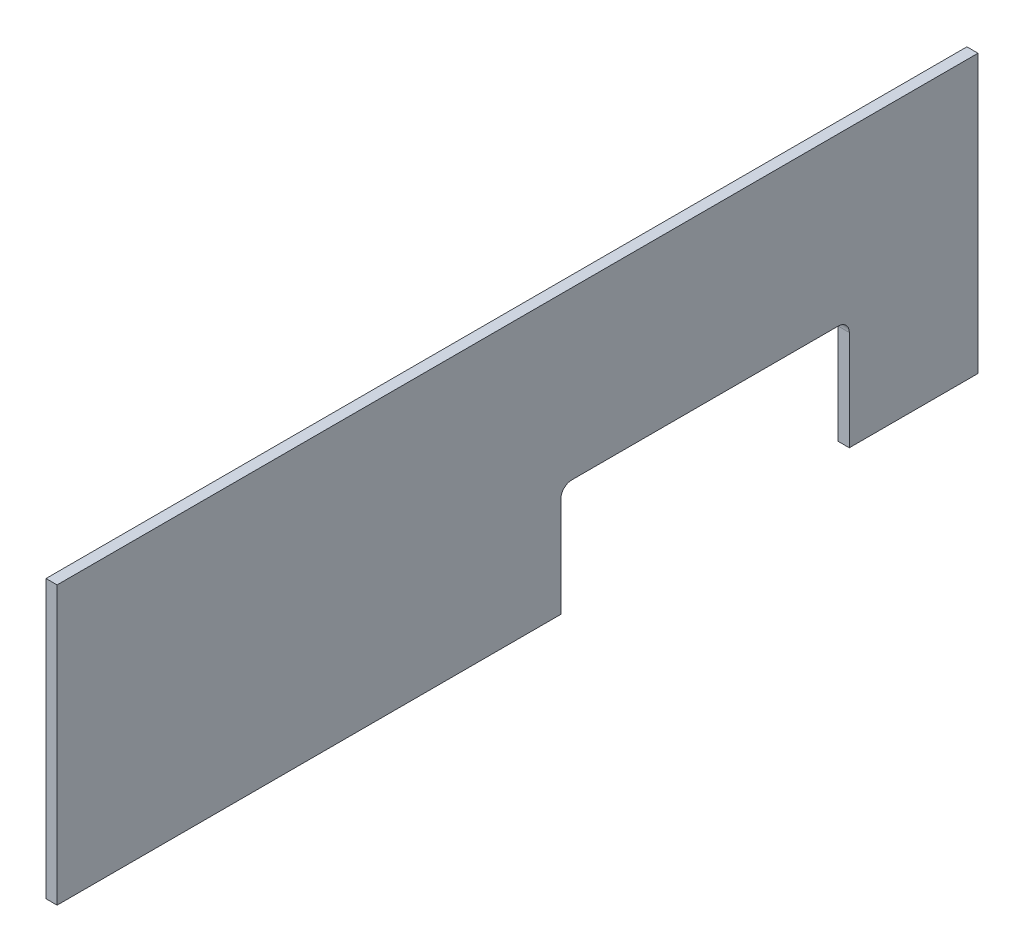
ISO-10303-21;
HEADER;
FILE_DESCRIPTION(('STEP AP214'),'2;1');
FILE_NAME('part.step','',(''),(''),'','','');
FILE_SCHEMA(('AUTOMOTIVE_DESIGN { 1 0 10303 214 1 1 1 1 }'));
ENDSEC;
DATA;
#1=APPLICATION_CONTEXT('core data for automotive mechanical design processes');
#2=APPLICATION_PROTOCOL_DEFINITION('international standard','automotive_design',2000,#1);
#3=PRODUCT_CONTEXT('',#1,'mechanical');
#4=PRODUCT('Part','Part','',(#3));
#5=PRODUCT_RELATED_PRODUCT_CATEGORY('part','',(#4));
#6=PRODUCT_DEFINITION_FORMATION('','',#4);
#7=PRODUCT_DEFINITION_CONTEXT('part definition',#1,'design');
#8=PRODUCT_DEFINITION('design','',#6,#7);
#9=PRODUCT_DEFINITION_SHAPE('','',#8);
#10=(LENGTH_UNIT() NAMED_UNIT(*) SI_UNIT(.MILLI.,.METRE.));
#11=(NAMED_UNIT(*) PLANE_ANGLE_UNIT() SI_UNIT($,.RADIAN.));
#12=(NAMED_UNIT(*) SI_UNIT($,.STERADIAN.) SOLID_ANGLE_UNIT());
#13=UNCERTAINTY_MEASURE_WITH_UNIT(LENGTH_MEASURE(1.E-05),#10,'distance_accuracy_value','');
#14=(GEOMETRIC_REPRESENTATION_CONTEXT(3) GLOBAL_UNCERTAINTY_ASSIGNED_CONTEXT((#13)) GLOBAL_UNIT_ASSIGNED_CONTEXT((#10,
#11,#12)) REPRESENTATION_CONTEXT('',''));
#15=CARTESIAN_POINT('',(0.,0.,0.));
#16=DIRECTION('',(0.,0.,1.));
#17=DIRECTION('',(1.,0.,0.));
#18=AXIS2_PLACEMENT_3D('',#15,#16,#17);
#19=CARTESIAN_POINT('',(1.,0.,-29.9));
#20=DIRECTION('',(0.,0.,1.));
#21=DIRECTION('',(1.,0.,0.));
#22=AXIS2_PLACEMENT_3D('',#19,#20,#21);
#23=PLANE('',#22);
#24=DIRECTION('',(0.,1.,0.));
#25=VECTOR('',#24,1.);
#26=CARTESIAN_POINT('',(1.,0.,-29.9));
#27=LINE('',#26,#25);
#28=CARTESIAN_POINT('',(1.,-12.5,-29.9));
#29=VERTEX_POINT('',#28);
#30=CARTESIAN_POINT('',(1.,-3.5,-29.9));
#31=VERTEX_POINT('',#30);
#32=EDGE_CURVE('E114',#29,#31,#27,.T.);
#33=ORIENTED_EDGE('',*,*,#32,.T.);
#34=DIRECTION('',(-1.,0.,0.));
#35=VECTOR('',#34,1.);
#36=CARTESIAN_POINT('',(1.,-3.5,-29.9));
#37=LINE('',#36,#35);
#38=CARTESIAN_POINT('',(0.,-3.5,-29.9));
#39=VERTEX_POINT('',#38);
#40=EDGE_CURVE('E120',#31,#39,#37,.T.);
#41=ORIENTED_EDGE('',*,*,#40,.T.);
#42=DIRECTION('',(0.,1.,0.));
#43=VECTOR('',#42,1.);
#44=CARTESIAN_POINT('',(0.,0.,-29.9));
#45=LINE('',#44,#43);
#46=CARTESIAN_POINT('',(0.,-12.5,-29.9));
#47=VERTEX_POINT('',#46);
#48=EDGE_CURVE('E117',#47,#39,#45,.T.);
#49=ORIENTED_EDGE('',*,*,#48,.F.);
#50=DIRECTION('',(-1.,0.,0.));
#51=VECTOR('',#50,1.);
#52=CARTESIAN_POINT('',(1.,-12.5,-29.9));
#53=LINE('',#52,#51);
#54=EDGE_CURVE('E110',#29,#47,#53,.T.);
#55=ORIENTED_EDGE('',*,*,#54,.F.);
#56=EDGE_LOOP('',(#33,#41,#49,#55));
#57=FACE_BOUND('',#56,.T.);
#58=ADVANCED_FACE('F33',(#57),#23,.T.);
#59=CARTESIAN_POINT('',(1.,-12.5,0.));
#60=DIRECTION('',(0.,1.,0.));
#61=DIRECTION('',(0.,0.,1.));
#62=AXIS2_PLACEMENT_3D('',#59,#60,#61);
#63=PLANE('',#62);
#64=DIRECTION('',(0.,0.,-1.));
#65=VECTOR('',#64,1.);
#66=CARTESIAN_POINT('',(0.,-12.5,0.));
#67=LINE('',#66,#65);
#68=CARTESIAN_POINT('',(0.,-12.5,-41.5));
#69=VERTEX_POINT('',#68);
#70=EDGE_CURVE('E155',#47,#69,#67,.T.);
#71=ORIENTED_EDGE('',*,*,#70,.T.);
#72=DIRECTION('',(-1.,0.,0.));
#73=VECTOR('',#72,1.);
#74=CARTESIAN_POINT('',(1.,-12.5,-41.5));
#75=LINE('',#74,#73);
#76=CARTESIAN_POINT('',(1.,-12.5,-41.5));
#77=VERTEX_POINT('',#76);
#78=EDGE_CURVE('E121',#77,#69,#75,.T.);
#79=ORIENTED_EDGE('',*,*,#78,.F.);
#80=DIRECTION('',(0.,0.,-1.));
#81=VECTOR('',#80,1.);
#82=CARTESIAN_POINT('',(1.,-12.5,0.));
#83=LINE('',#82,#81);
#84=EDGE_CURVE('E124',#29,#77,#83,.T.);
#85=ORIENTED_EDGE('',*,*,#84,.F.);
#86=ORIENTED_EDGE('',*,*,#54,.T.);
#87=EDGE_LOOP('',(#71,#79,#85,#86));
#88=FACE_BOUND('',#87,.T.);
#89=ADVANCED_FACE('F125',(#88),#63,.F.);
#90=CARTESIAN_POINT('',(1.,0.,-41.5));
#91=DIRECTION('',(0.,0.,1.));
#92=DIRECTION('',(1.,0.,0.));
#93=AXIS2_PLACEMENT_3D('',#90,#91,#92);
#94=PLANE('',#93);
#95=DIRECTION('',(0.,1.,0.));
#96=VECTOR('',#95,1.);
#97=CARTESIAN_POINT('',(0.,0.,-41.5));
#98=LINE('',#97,#96);
#99=CARTESIAN_POINT('',(0.,12.5,-41.5));
#100=VERTEX_POINT('',#99);
#101=EDGE_CURVE('E157',#69,#100,#98,.T.);
#102=ORIENTED_EDGE('',*,*,#101,.T.);
#103=DIRECTION('',(-1.,0.,0.));
#104=VECTOR('',#103,1.);
#105=CARTESIAN_POINT('',(1.,12.5,-41.5));
#106=LINE('',#105,#104);
#107=CARTESIAN_POINT('',(1.,12.5,-41.5));
#108=VERTEX_POINT('',#107);
#109=EDGE_CURVE('E174',#108,#100,#106,.T.);
#110=ORIENTED_EDGE('',*,*,#109,.F.);
#111=DIRECTION('',(0.,1.,0.));
#112=VECTOR('',#111,1.);
#113=CARTESIAN_POINT('',(1.,0.,-41.5));
#114=LINE('',#113,#112);
#115=EDGE_CURVE('E129',#77,#108,#114,.T.);
#116=ORIENTED_EDGE('',*,*,#115,.F.);
#117=ORIENTED_EDGE('',*,*,#78,.T.);
#118=EDGE_LOOP('',(#102,#110,#116,#117));
#119=FACE_BOUND('',#118,.T.);
#120=ADVANCED_FACE('F209',(#119),#94,.F.);
#121=CARTESIAN_POINT('',(1.,12.5,0.));
#122=DIRECTION('',(0.,1.,0.));
#123=DIRECTION('',(0.,0.,1.));
#124=AXIS2_PLACEMENT_3D('',#121,#122,#123);
#125=PLANE('',#124);
#126=DIRECTION('',(0.,0.,-1.));
#127=VECTOR('',#126,1.);
#128=CARTESIAN_POINT('',(0.,12.5,0.));
#129=LINE('',#128,#127);
#130=CARTESIAN_POINT('',(0.,12.5,41.5));
#131=VERTEX_POINT('',#130);
#132=EDGE_CURVE('E161',#131,#100,#129,.T.);
#133=ORIENTED_EDGE('',*,*,#132,.F.);
#134=DIRECTION('',(-1.,0.,0.));
#135=VECTOR('',#134,1.);
#136=CARTESIAN_POINT('',(1.,12.5,41.5));
#137=LINE('',#136,#135);
#138=CARTESIAN_POINT('',(1.,12.5,41.5));
#139=VERTEX_POINT('',#138);
#140=EDGE_CURVE('E172',#139,#131,#137,.T.);
#141=ORIENTED_EDGE('',*,*,#140,.F.);
#142=DIRECTION('',(0.,0.,-1.));
#143=VECTOR('',#142,1.);
#144=CARTESIAN_POINT('',(1.,12.5,0.));
#145=LINE('',#144,#143);
#146=EDGE_CURVE('E143',#139,#108,#145,.T.);
#147=ORIENTED_EDGE('',*,*,#146,.T.);
#148=ORIENTED_EDGE('',*,*,#109,.T.);
#149=EDGE_LOOP('',(#133,#141,#147,#148));
#150=FACE_BOUND('',#149,.T.);
#151=ADVANCED_FACE('F215',(#150),#125,.T.);
#152=CARTESIAN_POINT('',(1.,0.,41.5));
#153=DIRECTION('',(0.,0.,1.));
#154=DIRECTION('',(1.,0.,0.));
#155=AXIS2_PLACEMENT_3D('',#152,#153,#154);
#156=PLANE('',#155);
#157=DIRECTION('',(0.,1.,0.));
#158=VECTOR('',#157,1.);
#159=CARTESIAN_POINT('',(0.,0.,41.5));
#160=LINE('',#159,#158);
#161=CARTESIAN_POINT('',(0.,-12.5,41.5));
#162=VERTEX_POINT('',#161);
#163=EDGE_CURVE('E164',#162,#131,#160,.T.);
#164=ORIENTED_EDGE('',*,*,#163,.F.);
#165=DIRECTION('',(-1.,0.,0.));
#166=VECTOR('',#165,1.);
#167=CARTESIAN_POINT('',(1.,-12.5,41.5));
#168=LINE('',#167,#166);
#169=CARTESIAN_POINT('',(1.,-12.5,41.5));
#170=VERTEX_POINT('',#169);
#171=EDGE_CURVE('E170',#170,#162,#168,.T.);
#172=ORIENTED_EDGE('',*,*,#171,.F.);
#173=DIRECTION('',(0.,1.,0.));
#174=VECTOR('',#173,1.);
#175=CARTESIAN_POINT('',(1.,0.,41.5));
#176=LINE('',#175,#174);
#177=EDGE_CURVE('E146',#170,#139,#176,.T.);
#178=ORIENTED_EDGE('',*,*,#177,.T.);
#179=ORIENTED_EDGE('',*,*,#140,.T.);
#180=EDGE_LOOP('',(#164,#172,#178,#179));
#181=FACE_BOUND('',#180,.T.);
#182=ADVANCED_FACE('F219',(#181),#156,.T.);
#183=CARTESIAN_POINT('',(0.,-12.5,-3.90000000000001));
#184=VERTEX_POINT('',#183);
#185=EDGE_CURVE('E158',#162,#184,#67,.T.);
#186=ORIENTED_EDGE('',*,*,#185,.T.);
#187=DIRECTION('',(-1.,0.,0.));
#188=VECTOR('',#187,1.);
#189=CARTESIAN_POINT('',(1.,-12.5,-3.90000000000001));
#190=LINE('',#189,#188);
#191=CARTESIAN_POINT('',(1.,-12.5,-3.90000000000001));
#192=VERTEX_POINT('',#191);
#193=EDGE_CURVE('E153',#192,#184,#190,.T.);
#194=ORIENTED_EDGE('',*,*,#193,.F.);
#195=EDGE_CURVE('E131',#170,#192,#83,.T.);
#196=ORIENTED_EDGE('',*,*,#195,.F.);
#197=ORIENTED_EDGE('',*,*,#171,.T.);
#198=EDGE_LOOP('',(#186,#194,#196,#197));
#199=FACE_BOUND('',#198,.T.);
#200=ADVANCED_FACE('F211',(#199),#63,.F.);
#201=CARTESIAN_POINT('',(1.,0.,-3.90000000000001));
#202=DIRECTION('',(0.,0.,1.));
#203=DIRECTION('',(1.,0.,0.));
#204=AXIS2_PLACEMENT_3D('',#201,#202,#203);
#205=PLANE('',#204);
#206=DIRECTION('',(0.,1.,0.));
#207=VECTOR('',#206,1.);
#208=CARTESIAN_POINT('',(0.,0.,-3.90000000000001));
#209=LINE('',#208,#207);
#210=CARTESIAN_POINT('',(0.,-3.5,-3.90000000000001));
#211=VERTEX_POINT('',#210);
#212=EDGE_CURVE('E139',#184,#211,#209,.T.);
#213=ORIENTED_EDGE('',*,*,#212,.T.);
#214=DIRECTION('',(-1.,0.,0.));
#215=VECTOR('',#214,1.);
#216=CARTESIAN_POINT('',(1.,-3.5,-3.90000000000001));
#217=LINE('',#216,#215);
#218=CARTESIAN_POINT('',(1.,-3.5,-3.90000000000001));
#219=VERTEX_POINT('',#218);
#220=EDGE_CURVE('E48',#211,#219,#217,.F.);
#221=ORIENTED_EDGE('',*,*,#220,.T.);
#222=DIRECTION('',(0.,1.,0.));
#223=VECTOR('',#222,1.);
#224=CARTESIAN_POINT('',(1.,0.,-3.90000000000001));
#225=LINE('',#224,#223);
#226=EDGE_CURVE('E149',#192,#219,#225,.T.);
#227=ORIENTED_EDGE('',*,*,#226,.F.);
#228=ORIENTED_EDGE('',*,*,#193,.T.);
#229=EDGE_LOOP('',(#213,#221,#227,#228));
#230=FACE_BOUND('',#229,.T.);
#231=ADVANCED_FACE('F225',(#230),#205,.F.);
#232=CARTESIAN_POINT('',(1.,-2.5,0.));
#233=DIRECTION('',(0.,1.,0.));
#234=DIRECTION('',(0.,0.,1.));
#235=AXIS2_PLACEMENT_3D('',#232,#233,#234);
#236=PLANE('',#235);
#237=DIRECTION('',(0.,0.,-1.));
#238=VECTOR('',#237,1.);
#239=CARTESIAN_POINT('',(0.,-2.5,0.));
#240=LINE('',#239,#238);
#241=CARTESIAN_POINT('',(0.,-2.5,-4.90000000000001));
#242=VERTEX_POINT('',#241);
#243=CARTESIAN_POINT('',(0.,-2.5,-28.9));
#244=VERTEX_POINT('',#243);
#245=EDGE_CURVE('E136',#242,#244,#240,.T.);
#246=ORIENTED_EDGE('',*,*,#245,.T.);
#247=DIRECTION('',(-1.,0.,0.));
#248=VECTOR('',#247,1.);
#249=CARTESIAN_POINT('',(1.,-2.5,-28.9));
#250=LINE('',#249,#248);
#251=CARTESIAN_POINT('',(1.,-2.5,-28.9));
#252=VERTEX_POINT('',#251);
#253=EDGE_CURVE('E181',#244,#252,#250,.F.);
#254=ORIENTED_EDGE('',*,*,#253,.T.);
#255=DIRECTION('',(0.,0.,-1.));
#256=VECTOR('',#255,1.);
#257=CARTESIAN_POINT('',(1.,-2.5,0.));
#258=LINE('',#257,#256);
#259=CARTESIAN_POINT('',(1.,-2.5,-4.90000000000001));
#260=VERTEX_POINT('',#259);
#261=EDGE_CURVE('E151',#260,#252,#258,.T.);
#262=ORIENTED_EDGE('',*,*,#261,.F.);
#263=DIRECTION('',(-1.,0.,0.));
#264=VECTOR('',#263,1.);
#265=CARTESIAN_POINT('',(0.,-2.5,-4.90000000000001));
#266=LINE('',#265,#264);
#267=EDGE_CURVE('E178',#260,#242,#266,.T.);
#268=ORIENTED_EDGE('',*,*,#267,.T.);
#269=EDGE_LOOP('',(#246,#254,#262,#268));
#270=FACE_BOUND('',#269,.T.);
#271=ADVANCED_FACE('F190',(#270),#236,.F.);
#272=CARTESIAN_POINT('',(1.,0.,0.));
#273=DIRECTION('',(1.,0.,0.));
#274=DIRECTION('',(0.,0.,-1.));
#275=AXIS2_PLACEMENT_3D('',#272,#273,#274);
#276=PLANE('',#275);
#277=ORIENTED_EDGE('',*,*,#32,.F.);
#278=ORIENTED_EDGE('',*,*,#84,.T.);
#279=ORIENTED_EDGE('',*,*,#115,.T.);
#280=ORIENTED_EDGE('',*,*,#146,.F.);
#281=ORIENTED_EDGE('',*,*,#177,.F.);
#282=ORIENTED_EDGE('',*,*,#195,.T.);
#283=ORIENTED_EDGE('',*,*,#226,.T.);
#284=CARTESIAN_POINT('',(1.,-3.5,-4.90000000000001));
#285=DIRECTION('',(1.,0.,0.));
#286=DIRECTION('',(0.,0.,-1.));
#287=AXIS2_PLACEMENT_3D('',#284,#285,#286);
#288=CIRCLE('',#287,1.);
#289=EDGE_CURVE('E11',#219,#260,#288,.F.);
#290=ORIENTED_EDGE('',*,*,#289,.T.);
#291=ORIENTED_EDGE('',*,*,#261,.T.);
#292=CARTESIAN_POINT('',(1.,-3.5,-28.9));
#293=DIRECTION('',(1.,0.,0.));
#294=DIRECTION('',(0.,0.,-1.));
#295=AXIS2_PLACEMENT_3D('',#292,#293,#294);
#296=CIRCLE('',#295,1.);
#297=EDGE_CURVE('E135',#252,#31,#296,.F.);
#298=ORIENTED_EDGE('',*,*,#297,.T.);
#299=EDGE_LOOP('',(#277,#278,#279,#280,#281,#282,#283,#290,#291,#298));
#300=FACE_BOUND('',#299,.T.);
#301=ADVANCED_FACE('F132',(#300),#276,.T.);
#302=CARTESIAN_POINT('',(0.,0.,0.));
#303=DIRECTION('',(1.,0.,0.));
#304=DIRECTION('',(0.,0.,-1.));
#305=AXIS2_PLACEMENT_3D('',#302,#303,#304);
#306=PLANE('',#305);
#307=ORIENTED_EDGE('',*,*,#48,.T.);
#308=CARTESIAN_POINT('',(0.,-3.5,-28.9));
#309=DIRECTION('',(1.,0.,0.));
#310=DIRECTION('',(0.,0.,-1.));
#311=AXIS2_PLACEMENT_3D('',#308,#309,#310);
#312=CIRCLE('',#311,1.);
#313=EDGE_CURVE('E184',#39,#244,#312,.T.);
#314=ORIENTED_EDGE('',*,*,#313,.T.);
#315=ORIENTED_EDGE('',*,*,#245,.F.);
#316=CARTESIAN_POINT('',(0.,-3.5,-4.90000000000001));
#317=DIRECTION('',(1.,0.,0.));
#318=DIRECTION('',(0.,0.,-1.));
#319=AXIS2_PLACEMENT_3D('',#316,#317,#318);
#320=CIRCLE('',#319,1.);
#321=EDGE_CURVE('E41',#242,#211,#320,.T.);
#322=ORIENTED_EDGE('',*,*,#321,.T.);
#323=ORIENTED_EDGE('',*,*,#212,.F.);
#324=ORIENTED_EDGE('',*,*,#185,.F.);
#325=ORIENTED_EDGE('',*,*,#163,.T.);
#326=ORIENTED_EDGE('',*,*,#132,.T.);
#327=ORIENTED_EDGE('',*,*,#101,.F.);
#328=ORIENTED_EDGE('',*,*,#70,.F.);
#329=EDGE_LOOP('',(#307,#314,#315,#322,#323,#324,#325,#326,#327,#328));
#330=FACE_BOUND('',#329,.T.);
#331=ADVANCED_FACE('F186',(#330),#306,.F.);
#332=CARTESIAN_POINT('',(1.,-3.5,-28.9));
#333=DIRECTION('',(-1.,0.,0.));
#334=DIRECTION('',(0.,0.,1.));
#335=AXIS2_PLACEMENT_3D('',#332,#333,#334);
#336=CYLINDRICAL_SURFACE('',#335,1.);
#337=ORIENTED_EDGE('',*,*,#297,.F.);
#338=ORIENTED_EDGE('',*,*,#253,.F.);
#339=ORIENTED_EDGE('',*,*,#313,.F.);
#340=ORIENTED_EDGE('',*,*,#40,.F.);
#341=EDGE_LOOP('',(#337,#338,#339,#340));
#342=FACE_BOUND('',#341,.T.);
#343=ADVANCED_FACE('F193',(#342),#336,.F.);
#344=CARTESIAN_POINT('',(1.,-3.5,-4.90000000000001));
#345=DIRECTION('',(1.,0.,0.));
#346=DIRECTION('',(0.,0.,-1.));
#347=AXIS2_PLACEMENT_3D('',#344,#345,#346);
#348=CYLINDRICAL_SURFACE('',#347,1.);
#349=ORIENTED_EDGE('',*,*,#289,.F.);
#350=ORIENTED_EDGE('',*,*,#220,.F.);
#351=ORIENTED_EDGE('',*,*,#321,.F.);
#352=ORIENTED_EDGE('',*,*,#267,.F.);
#353=EDGE_LOOP('',(#349,#350,#351,#352));
#354=FACE_BOUND('',#353,.T.);
#355=ADVANCED_FACE('F35',(#354),#348,.F.);
#356=CLOSED_SHELL('',(#58,#89,#120,#151,#182,#200,#231,#271,#301,#331,#343,#355));
#357=MANIFOLD_SOLID_BREP('B2',#356);
#358=ADVANCED_BREP_SHAPE_REPRESENTATION('',(#18,#357),#14);
#359=SHAPE_DEFINITION_REPRESENTATION(#9,#358);
ENDSEC;
END-ISO-10303-21;
